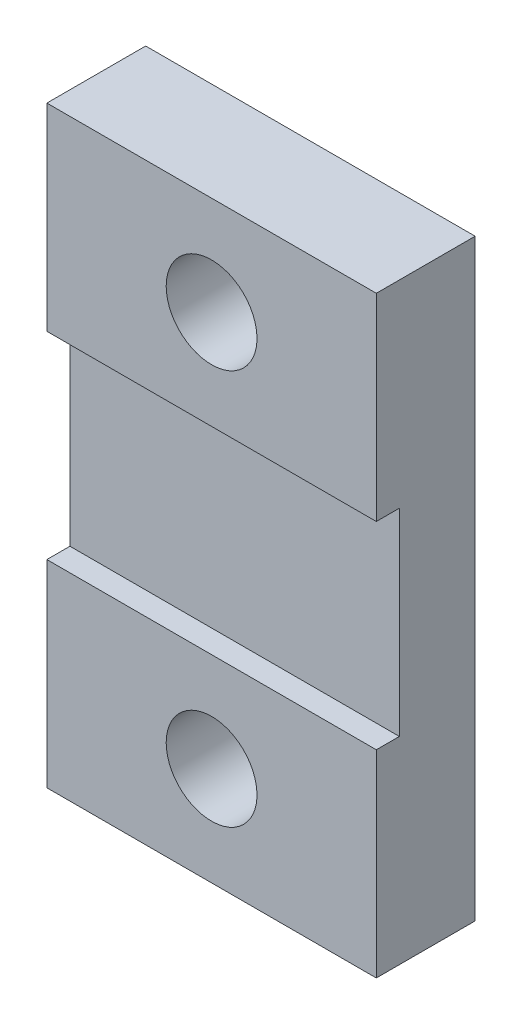
ISO-10303-21;
HEADER;
FILE_DESCRIPTION(('STEP AP214'),'2;1');
FILE_NAME('part.step','',(''),(''),'','','');
FILE_SCHEMA(('AUTOMOTIVE_DESIGN { 1 0 10303 214 1 1 1 1 }'));
ENDSEC;
DATA;
#1=APPLICATION_CONTEXT('core data for automotive mechanical design processes');
#2=APPLICATION_PROTOCOL_DEFINITION('international standard','automotive_design',2000,#1);
#3=PRODUCT_CONTEXT('',#1,'mechanical');
#4=PRODUCT('Part','Part','',(#3));
#5=PRODUCT_RELATED_PRODUCT_CATEGORY('part','',(#4));
#6=PRODUCT_DEFINITION_FORMATION('','',#4);
#7=PRODUCT_DEFINITION_CONTEXT('part definition',#1,'design');
#8=PRODUCT_DEFINITION('design','',#6,#7);
#9=PRODUCT_DEFINITION_SHAPE('','',#8);
#10=(LENGTH_UNIT() NAMED_UNIT(*) SI_UNIT(.MILLI.,.METRE.));
#11=(NAMED_UNIT(*) PLANE_ANGLE_UNIT() SI_UNIT($,.RADIAN.));
#12=(NAMED_UNIT(*) SI_UNIT($,.STERADIAN.) SOLID_ANGLE_UNIT());
#13=UNCERTAINTY_MEASURE_WITH_UNIT(LENGTH_MEASURE(1.E-05),#10,'distance_accuracy_value','');
#14=(GEOMETRIC_REPRESENTATION_CONTEXT(3) GLOBAL_UNCERTAINTY_ASSIGNED_CONTEXT((#13)) GLOBAL_UNIT_ASSIGNED_CONTEXT((#10,
#11,#12)) REPRESENTATION_CONTEXT('',''));
#15=CARTESIAN_POINT('',(0.,0.,0.));
#16=DIRECTION('',(0.,0.,1.));
#17=DIRECTION('',(1.,0.,0.));
#18=AXIS2_PLACEMENT_3D('',#15,#16,#17);
#19=CARTESIAN_POINT('',(0.,0.,3.81));
#20=DIRECTION('',(0.,0.,-1.));
#21=DIRECTION('',(-1.,0.,0.));
#22=AXIS2_PLACEMENT_3D('',#19,#20,#21);
#23=PLANE('',#22);
#24=CARTESIAN_POINT('',(0.,-7.62,3.81));
#25=DIRECTION('',(0.,0.,1.));
#26=DIRECTION('',(-1.,0.,0.));
#27=AXIS2_PLACEMENT_3D('',#24,#25,#26);
#28=CIRCLE('',#27,1.75);
#29=CARTESIAN_POINT('',(-1.75,-7.62,3.81));
#30=VERTEX_POINT('',#29);
#31=EDGE_CURVE('E138',#30,#30,#28,.T.);
#32=ORIENTED_EDGE('',*,*,#31,.F.);
#33=EDGE_LOOP('',(#32));
#34=FACE_BOUND('',#33,.T.);
#35=DIRECTION('',(0.,1.,0.));
#36=VECTOR('',#35,1.);
#37=CARTESIAN_POINT('',(6.34999999999999,-11.43,3.81));
#38=LINE('',#37,#36);
#39=CARTESIAN_POINT('',(6.34999999999999,-11.43,3.81));
#40=VERTEX_POINT('',#39);
#41=CARTESIAN_POINT('',(6.34999999999999,-3.81,3.81));
#42=VERTEX_POINT('',#41);
#43=EDGE_CURVE('E152',#40,#42,#38,.T.);
#44=ORIENTED_EDGE('',*,*,#43,.T.);
#45=DIRECTION('',(1.,0.,0.));
#46=VECTOR('',#45,1.);
#47=CARTESIAN_POINT('',(-6.34999999999999,-3.81,3.81));
#48=LINE('',#47,#46);
#49=CARTESIAN_POINT('',(-6.34999999999999,-3.81,3.81));
#50=VERTEX_POINT('',#49);
#51=EDGE_CURVE('E129',#50,#42,#48,.T.);
#52=ORIENTED_EDGE('',*,*,#51,.F.);
#53=DIRECTION('',(0.,-1.,0.));
#54=VECTOR('',#53,1.);
#55=CARTESIAN_POINT('',(-6.35000000000001,-11.43,3.81));
#56=LINE('',#55,#54);
#57=CARTESIAN_POINT('',(-6.35000000000001,-11.43,3.81));
#58=VERTEX_POINT('',#57);
#59=EDGE_CURVE('E156',#50,#58,#56,.T.);
#60=ORIENTED_EDGE('',*,*,#59,.T.);
#61=DIRECTION('',(1.,0.,0.));
#62=VECTOR('',#61,1.);
#63=CARTESIAN_POINT('',(-6.35000000000001,-11.43,3.81));
#64=LINE('',#63,#62);
#65=EDGE_CURVE('E63',#58,#40,#64,.T.);
#66=ORIENTED_EDGE('',*,*,#65,.T.);
#67=EDGE_LOOP('',(#44,#52,#60,#66));
#68=FACE_BOUND('',#67,.T.);
#69=ADVANCED_FACE('F39',(#34,#68),#23,.F.);
#70=CARTESIAN_POINT('',(-6.35000000000001,11.43,3.81));
#71=VERTEX_POINT('',#70);
#72=CARTESIAN_POINT('',(-6.34999999999999,3.81,3.81));
#73=VERTEX_POINT('',#72);
#74=EDGE_CURVE('E157',#71,#73,#56,.T.);
#75=ORIENTED_EDGE('',*,*,#74,.T.);
#76=DIRECTION('',(-1.,0.,0.));
#77=VECTOR('',#76,1.);
#78=CARTESIAN_POINT('',(-6.34999999999999,3.81,3.81));
#79=LINE('',#78,#77);
#80=CARTESIAN_POINT('',(6.34999999999999,3.81,3.81));
#81=VERTEX_POINT('',#80);
#82=EDGE_CURVE('E189',#81,#73,#79,.T.);
#83=ORIENTED_EDGE('',*,*,#82,.F.);
#84=CARTESIAN_POINT('',(6.34999999999999,11.43,3.81));
#85=VERTEX_POINT('',#84);
#86=EDGE_CURVE('E92',#81,#85,#38,.T.);
#87=ORIENTED_EDGE('',*,*,#86,.T.);
#88=DIRECTION('',(-1.,0.,0.));
#89=VECTOR('',#88,1.);
#90=CARTESIAN_POINT('',(-6.35000000000001,11.43,3.81));
#91=LINE('',#90,#89);
#92=EDGE_CURVE('E154',#85,#71,#91,.T.);
#93=ORIENTED_EDGE('',*,*,#92,.T.);
#94=EDGE_LOOP('',(#75,#83,#87,#93));
#95=FACE_BOUND('',#94,.T.);
#96=CARTESIAN_POINT('',(0.,7.62,3.81));
#97=DIRECTION('',(0.,0.,1.));
#98=DIRECTION('',(1.,0.,0.));
#99=AXIS2_PLACEMENT_3D('',#96,#97,#98);
#100=CIRCLE('',#99,1.75);
#101=CARTESIAN_POINT('',(-1.75,7.62,3.81));
#102=VERTEX_POINT('',#101);
#103=EDGE_CURVE('E146',#102,#102,#100,.T.);
#104=ORIENTED_EDGE('',*,*,#103,.F.);
#105=EDGE_LOOP('',(#104));
#106=FACE_BOUND('',#105,.T.);
#107=ADVANCED_FACE('F208',(#95,#106),#23,.F.);
#108=CARTESIAN_POINT('',(0.,0.,0.));
#109=DIRECTION('',(0.,0.,-1.));
#110=DIRECTION('',(-1.,0.,0.));
#111=AXIS2_PLACEMENT_3D('',#108,#109,#110);
#112=PLANE('',#111);
#113=CARTESIAN_POINT('',(0.,7.62,0.));
#114=DIRECTION('',(0.,0.,1.));
#115=DIRECTION('',(1.,0.,0.));
#116=AXIS2_PLACEMENT_3D('',#113,#114,#115);
#117=CIRCLE('',#116,1.75);
#118=CARTESIAN_POINT('',(-1.75,7.62,0.));
#119=VERTEX_POINT('',#118);
#120=EDGE_CURVE('E141',#119,#119,#117,.T.);
#121=ORIENTED_EDGE('',*,*,#120,.T.);
#122=EDGE_LOOP('',(#121));
#123=FACE_BOUND('',#122,.T.);
#124=DIRECTION('',(0.,1.,0.));
#125=VECTOR('',#124,1.);
#126=CARTESIAN_POINT('',(6.34999999999999,-11.43,0.));
#127=LINE('',#126,#125);
#128=CARTESIAN_POINT('',(6.34999999999999,-11.43,0.));
#129=VERTEX_POINT('',#128);
#130=CARTESIAN_POINT('',(6.34999999999999,11.43,0.));
#131=VERTEX_POINT('',#130);
#132=EDGE_CURVE('E149',#129,#131,#127,.T.);
#133=ORIENTED_EDGE('',*,*,#132,.F.);
#134=DIRECTION('',(1.,0.,0.));
#135=VECTOR('',#134,1.);
#136=CARTESIAN_POINT('',(-6.35000000000001,-11.43,0.));
#137=LINE('',#136,#135);
#138=CARTESIAN_POINT('',(-6.35000000000001,-11.43,0.));
#139=VERTEX_POINT('',#138);
#140=EDGE_CURVE('E84',#139,#129,#137,.T.);
#141=ORIENTED_EDGE('',*,*,#140,.F.);
#142=DIRECTION('',(0.,-1.,0.));
#143=VECTOR('',#142,1.);
#144=CARTESIAN_POINT('',(-6.35000000000001,-11.43,0.));
#145=LINE('',#144,#143);
#146=CARTESIAN_POINT('',(-6.35000000000001,11.43,0.));
#147=VERTEX_POINT('',#146);
#148=EDGE_CURVE('E166',#147,#139,#145,.T.);
#149=ORIENTED_EDGE('',*,*,#148,.F.);
#150=DIRECTION('',(-1.,0.,0.));
#151=VECTOR('',#150,1.);
#152=CARTESIAN_POINT('',(-6.35000000000001,11.43,0.));
#153=LINE('',#152,#151);
#154=EDGE_CURVE('E164',#131,#147,#153,.T.);
#155=ORIENTED_EDGE('',*,*,#154,.F.);
#156=EDGE_LOOP('',(#133,#141,#149,#155));
#157=FACE_BOUND('',#156,.T.);
#158=CARTESIAN_POINT('',(0.,-7.62,0.));
#159=DIRECTION('',(0.,0.,1.));
#160=DIRECTION('',(-1.,0.,0.));
#161=AXIS2_PLACEMENT_3D('',#158,#159,#160);
#162=CIRCLE('',#161,1.75);
#163=CARTESIAN_POINT('',(-1.75,-7.62,0.));
#164=VERTEX_POINT('',#163);
#165=EDGE_CURVE('E142',#164,#164,#162,.T.);
#166=ORIENTED_EDGE('',*,*,#165,.T.);
#167=EDGE_LOOP('',(#166));
#168=FACE_BOUND('',#167,.T.);
#169=ADVANCED_FACE('F182',(#123,#157,#168),#112,.T.);
#170=CARTESIAN_POINT('',(6.34999999999999,-11.43,3.81));
#171=DIRECTION('',(-1.,0.,0.));
#172=DIRECTION('',(0.,0.,1.));
#173=AXIS2_PLACEMENT_3D('',#170,#171,#172);
#174=PLANE('',#173);
#175=DIRECTION('',(0.,1.,0.));
#176=VECTOR('',#175,1.);
#177=CARTESIAN_POINT('',(6.34999999999999,-3.81,2.921));
#178=LINE('',#177,#176);
#179=CARTESIAN_POINT('',(6.34999999999999,-3.81,2.921));
#180=VERTEX_POINT('',#179);
#181=CARTESIAN_POINT('',(6.34999999999999,3.81,2.921));
#182=VERTEX_POINT('',#181);
#183=EDGE_CURVE('E120',#180,#182,#178,.T.);
#184=ORIENTED_EDGE('',*,*,#183,.F.);
#185=DIRECTION('',(0.,0.,1.));
#186=VECTOR('',#185,1.);
#187=CARTESIAN_POINT('',(6.34999999999999,-3.81,2.921));
#188=LINE('',#187,#186);
#189=EDGE_CURVE('E145',#180,#42,#188,.T.);
#190=ORIENTED_EDGE('',*,*,#189,.T.);
#191=ORIENTED_EDGE('',*,*,#43,.F.);
#192=DIRECTION('',(0.,0.,-1.));
#193=VECTOR('',#192,1.);
#194=CARTESIAN_POINT('',(6.34999999999999,-11.43,3.81));
#195=LINE('',#194,#193);
#196=EDGE_CURVE('E161',#40,#129,#195,.T.);
#197=ORIENTED_EDGE('',*,*,#196,.T.);
#198=ORIENTED_EDGE('',*,*,#132,.T.);
#199=DIRECTION('',(0.,0.,-1.));
#200=VECTOR('',#199,1.);
#201=CARTESIAN_POINT('',(6.34999999999999,11.43,3.81));
#202=LINE('',#201,#200);
#203=EDGE_CURVE('E11',#85,#131,#202,.T.);
#204=ORIENTED_EDGE('',*,*,#203,.F.);
#205=ORIENTED_EDGE('',*,*,#86,.F.);
#206=DIRECTION('',(0.,0.,1.));
#207=VECTOR('',#206,1.);
#208=CARTESIAN_POINT('',(6.34999999999999,3.81,2.921));
#209=LINE('',#208,#207);
#210=EDGE_CURVE('E115',#182,#81,#209,.T.);
#211=ORIENTED_EDGE('',*,*,#210,.F.);
#212=EDGE_LOOP('',(#184,#190,#191,#197,#198,#204,#205,#211));
#213=FACE_BOUND('',#212,.T.);
#214=ADVANCED_FACE('F41',(#213),#174,.F.);
#215=CARTESIAN_POINT('',(-6.35000000000001,11.43,3.81));
#216=DIRECTION('',(0.,-1.,0.));
#217=DIRECTION('',(0.,0.,-1.));
#218=AXIS2_PLACEMENT_3D('',#215,#216,#217);
#219=PLANE('',#218);
#220=ORIENTED_EDGE('',*,*,#154,.T.);
#221=DIRECTION('',(0.,0.,-1.));
#222=VECTOR('',#221,1.);
#223=CARTESIAN_POINT('',(-6.35000000000001,11.43,3.81));
#224=LINE('',#223,#222);
#225=EDGE_CURVE('E47',#71,#147,#224,.T.);
#226=ORIENTED_EDGE('',*,*,#225,.F.);
#227=ORIENTED_EDGE('',*,*,#92,.F.);
#228=ORIENTED_EDGE('',*,*,#203,.T.);
#229=EDGE_LOOP('',(#220,#226,#227,#228));
#230=FACE_BOUND('',#229,.T.);
#231=ADVANCED_FACE('F222',(#230),#219,.F.);
#232=CARTESIAN_POINT('',(-6.35000000000001,-11.43,3.81));
#233=DIRECTION('',(1.,0.,0.));
#234=DIRECTION('',(0.,0.,-1.));
#235=AXIS2_PLACEMENT_3D('',#232,#233,#234);
#236=PLANE('',#235);
#237=ORIENTED_EDGE('',*,*,#59,.F.);
#238=DIRECTION('',(0.,0.,1.));
#239=VECTOR('',#238,1.);
#240=CARTESIAN_POINT('',(-6.34999999999999,-3.81,2.921));
#241=LINE('',#240,#239);
#242=CARTESIAN_POINT('',(-6.34999999999999,-3.81,2.921));
#243=VERTEX_POINT('',#242);
#244=EDGE_CURVE('E133',#243,#50,#241,.T.);
#245=ORIENTED_EDGE('',*,*,#244,.F.);
#246=DIRECTION('',(0.,-1.,0.));
#247=VECTOR('',#246,1.);
#248=CARTESIAN_POINT('',(-6.34999999999999,-3.81,2.921));
#249=LINE('',#248,#247);
#250=CARTESIAN_POINT('',(-6.35000000000001,3.81,2.921));
#251=VERTEX_POINT('',#250);
#252=EDGE_CURVE('E119',#251,#243,#249,.T.);
#253=ORIENTED_EDGE('',*,*,#252,.F.);
#254=DIRECTION('',(0.,0.,1.));
#255=VECTOR('',#254,1.);
#256=CARTESIAN_POINT('',(-6.34999999999999,3.81,2.921));
#257=LINE('',#256,#255);
#258=EDGE_CURVE('E117',#251,#73,#257,.T.);
#259=ORIENTED_EDGE('',*,*,#258,.T.);
#260=ORIENTED_EDGE('',*,*,#74,.F.);
#261=ORIENTED_EDGE('',*,*,#225,.T.);
#262=ORIENTED_EDGE('',*,*,#148,.T.);
#263=DIRECTION('',(0.,0.,-1.));
#264=VECTOR('',#263,1.);
#265=CARTESIAN_POINT('',(-6.35000000000001,-11.43,3.81));
#266=LINE('',#265,#264);
#267=EDGE_CURVE('E170',#58,#139,#266,.T.);
#268=ORIENTED_EDGE('',*,*,#267,.F.);
#269=EDGE_LOOP('',(#237,#245,#253,#259,#260,#261,#262,#268));
#270=FACE_BOUND('',#269,.T.);
#271=ADVANCED_FACE('F177',(#270),#236,.F.);
#272=CARTESIAN_POINT('',(-6.35000000000001,-11.43,3.81));
#273=DIRECTION('',(0.,1.,0.));
#274=DIRECTION('',(0.,0.,1.));
#275=AXIS2_PLACEMENT_3D('',#272,#273,#274);
#276=PLANE('',#275);
#277=ORIENTED_EDGE('',*,*,#140,.T.);
#278=ORIENTED_EDGE('',*,*,#196,.F.);
#279=ORIENTED_EDGE('',*,*,#65,.F.);
#280=ORIENTED_EDGE('',*,*,#267,.T.);
#281=EDGE_LOOP('',(#277,#278,#279,#280));
#282=FACE_BOUND('',#281,.T.);
#283=ADVANCED_FACE('F185',(#282),#276,.F.);
#284=CARTESIAN_POINT('',(0.,7.62,3.81));
#285=DIRECTION('',(0.,0.,-1.));
#286=DIRECTION('',(-1.,0.,0.));
#287=AXIS2_PLACEMENT_3D('',#284,#285,#286);
#288=CYLINDRICAL_SURFACE('',#287,1.75);
#289=CARTESIAN_POINT('',(-1.75,7.62,3.81));
#290=CARTESIAN_POINT('',(-1.75,7.62,3.7703125));
#291=CARTESIAN_POINT('',(-1.75,7.62,3.730625));
#292=CARTESIAN_POINT('',(-1.75,7.62,3.65125));
#293=CARTESIAN_POINT('',(-1.75,7.62,3.6115625));
#294=CARTESIAN_POINT('',(-1.75,7.62,3.5321875));
#295=CARTESIAN_POINT('',(-1.75,7.62,3.4925));
#296=CARTESIAN_POINT('',(-1.75,7.62,3.413125));
#297=CARTESIAN_POINT('',(-1.75,7.62,3.3734375));
#298=CARTESIAN_POINT('',(-1.75,7.62,3.2940625));
#299=CARTESIAN_POINT('',(-1.75,7.62,3.254375));
#300=CARTESIAN_POINT('',(-1.75,7.62,3.175));
#301=CARTESIAN_POINT('',(-1.75,7.62,3.1353125));
#302=CARTESIAN_POINT('',(-1.75,7.62,3.0559375));
#303=CARTESIAN_POINT('',(-1.75,7.62,3.01625));
#304=CARTESIAN_POINT('',(-1.75,7.62,2.936875));
#305=CARTESIAN_POINT('',(-1.75,7.62,2.8971875));
#306=CARTESIAN_POINT('',(-1.75,7.62,2.8178125));
#307=CARTESIAN_POINT('',(-1.75,7.62,2.778125));
#308=CARTESIAN_POINT('',(-1.75,7.62,2.69875));
#309=CARTESIAN_POINT('',(-1.75,7.62,2.6590625));
#310=CARTESIAN_POINT('',(-1.75,7.62,2.5796875));
#311=CARTESIAN_POINT('',(-1.75,7.62,2.54));
#312=CARTESIAN_POINT('',(-1.75,7.62,2.460625));
#313=CARTESIAN_POINT('',(-1.75,7.62,2.4209375));
#314=CARTESIAN_POINT('',(-1.75,7.62,2.3415625));
#315=CARTESIAN_POINT('',(-1.75,7.62,2.301875));
#316=CARTESIAN_POINT('',(-1.75,7.62,2.2225));
#317=CARTESIAN_POINT('',(-1.75,7.62,2.1828125));
#318=CARTESIAN_POINT('',(-1.75,7.62,2.1034375));
#319=CARTESIAN_POINT('',(-1.75,7.62,2.06375));
#320=CARTESIAN_POINT('',(-1.75,7.62,1.984375));
#321=CARTESIAN_POINT('',(-1.75,7.62,1.9446875));
#322=CARTESIAN_POINT('',(-1.75,7.62,1.8653125));
#323=CARTESIAN_POINT('',(-1.75,7.62,1.825625));
#324=CARTESIAN_POINT('',(-1.75,7.62,1.74625));
#325=CARTESIAN_POINT('',(-1.75,7.62,1.7065625));
#326=CARTESIAN_POINT('',(-1.75,7.62,1.6271875));
#327=CARTESIAN_POINT('',(-1.75,7.62,1.5875));
#328=CARTESIAN_POINT('',(-1.75,7.62,1.508125));
#329=CARTESIAN_POINT('',(-1.75,7.62,1.4684375));
#330=CARTESIAN_POINT('',(-1.75,7.62,1.3890625));
#331=CARTESIAN_POINT('',(-1.75,7.62,1.349375));
#332=CARTESIAN_POINT('',(-1.75,7.62,1.27));
#333=CARTESIAN_POINT('',(-1.75,7.62,1.2303125));
#334=CARTESIAN_POINT('',(-1.75,7.62,1.1509375));
#335=CARTESIAN_POINT('',(-1.75,7.62,1.11125));
#336=CARTESIAN_POINT('',(-1.75,7.62,1.031875));
#337=CARTESIAN_POINT('',(-1.75,7.62,0.9921875));
#338=CARTESIAN_POINT('',(-1.75,7.62,0.9128125));
#339=CARTESIAN_POINT('',(-1.75,7.62,0.873125));
#340=CARTESIAN_POINT('',(-1.75,7.62,0.79375));
#341=CARTESIAN_POINT('',(-1.75,7.62,0.7540625));
#342=CARTESIAN_POINT('',(-1.75,7.62,0.6746875));
#343=CARTESIAN_POINT('',(-1.75,7.62,0.635));
#344=CARTESIAN_POINT('',(-1.75,7.62,0.555625));
#345=CARTESIAN_POINT('',(-1.75,7.62,0.5159375));
#346=CARTESIAN_POINT('',(-1.75,7.62,0.4365625));
#347=CARTESIAN_POINT('',(-1.75,7.62,0.396875));
#348=CARTESIAN_POINT('',(-1.75,7.62,0.3175));
#349=CARTESIAN_POINT('',(-1.75,7.62,0.2778125));
#350=CARTESIAN_POINT('',(-1.75,7.62,0.1984375));
#351=CARTESIAN_POINT('',(-1.75,7.62,0.15875));
#352=CARTESIAN_POINT('',(-1.75,7.62,0.0793749999999999));
#353=CARTESIAN_POINT('',(-1.75,7.62,0.0396874999999999));
#354=CARTESIAN_POINT('',(-1.75,7.62,0.));
#355=B_SPLINE_CURVE_WITH_KNOTS('',3,(#289,#290,#291,#292,#293,#294,#295,#296,#297,#298,#299,
#300,#301,#302,#303,#304,#305,#306,#307,#308,#309,#310,#311,#312,#313,#314,#315,#316,#317,#318,
#319,#320,#321,#322,#323,#324,#325,#326,#327,#328,#329,#330,#331,#332,#333,#334,#335,#336,#337,
#338,#339,#340,#341,#342,#343,#344,#345,#346,#347,#348,#349,#350,#351,#352,#353,#354),
.UNSPECIFIED.,.F.,.F.,(4,2,2,2,2,2,2,2,2,2,2,2,2,2,2,2,2,2,2,2,2,2,2,2,2,2,2,2,2,2,2,2,4),(0.,
0.1190625,0.238125,0.3571875,0.47625,0.5953125,0.714375,0.8334375,0.9525,1.0715625,1.190625,
1.3096875,1.42875,1.5478125,1.666875,1.7859375,1.905,2.0240625,2.143125,2.2621875,2.38125,
2.5003125,2.619375,2.7384375,2.8575,2.9765625,3.095625,3.2146875,3.33375,3.4528125,3.571875,
3.6909375,3.81),.UNSPECIFIED.);
#356=EDGE_CURVE('BSEAM203',#102,#119,#355,.T.);
#357=ORIENTED_EDGE('',*,*,#103,.T.);
#358=ORIENTED_EDGE('',*,*,#120,.F.);
#359=ORIENTED_EDGE('',*,*,#356,.T.);
#360=ORIENTED_EDGE('',*,*,#356,.F.);
#361=EDGE_LOOP('',(#357,#359,#358,#360));
#362=FACE_BOUND('',#361,.T.);
#363=ADVANCED_FACE('F203',(#362),#288,.F.);
#364=CARTESIAN_POINT('',(0.,-7.62,3.81));
#365=DIRECTION('',(0.,0.,-1.));
#366=DIRECTION('',(-1.,0.,0.));
#367=AXIS2_PLACEMENT_3D('',#364,#365,#366);
#368=CYLINDRICAL_SURFACE('',#367,1.75);
#369=CARTESIAN_POINT('',(-1.75,-7.62,3.81));
#370=CARTESIAN_POINT('',(-1.75,-7.62,3.7703125));
#371=CARTESIAN_POINT('',(-1.75,-7.62,3.730625));
#372=CARTESIAN_POINT('',(-1.75,-7.62,3.65125));
#373=CARTESIAN_POINT('',(-1.75,-7.62,3.6115625));
#374=CARTESIAN_POINT('',(-1.75,-7.62,3.5321875));
#375=CARTESIAN_POINT('',(-1.75,-7.62,3.4925));
#376=CARTESIAN_POINT('',(-1.75,-7.62,3.413125));
#377=CARTESIAN_POINT('',(-1.75,-7.62,3.3734375));
#378=CARTESIAN_POINT('',(-1.75,-7.62,3.2940625));
#379=CARTESIAN_POINT('',(-1.75,-7.62,3.254375));
#380=CARTESIAN_POINT('',(-1.75,-7.62,3.175));
#381=CARTESIAN_POINT('',(-1.75,-7.62,3.1353125));
#382=CARTESIAN_POINT('',(-1.75,-7.62,3.0559375));
#383=CARTESIAN_POINT('',(-1.75,-7.62,3.01625));
#384=CARTESIAN_POINT('',(-1.75,-7.62,2.936875));
#385=CARTESIAN_POINT('',(-1.75,-7.62,2.8971875));
#386=CARTESIAN_POINT('',(-1.75,-7.62,2.8178125));
#387=CARTESIAN_POINT('',(-1.75,-7.62,2.778125));
#388=CARTESIAN_POINT('',(-1.75,-7.62,2.69875));
#389=CARTESIAN_POINT('',(-1.75,-7.62,2.6590625));
#390=CARTESIAN_POINT('',(-1.75,-7.62,2.5796875));
#391=CARTESIAN_POINT('',(-1.75,-7.62,2.54));
#392=CARTESIAN_POINT('',(-1.75,-7.62,2.460625));
#393=CARTESIAN_POINT('',(-1.75,-7.62,2.4209375));
#394=CARTESIAN_POINT('',(-1.75,-7.62,2.3415625));
#395=CARTESIAN_POINT('',(-1.75,-7.62,2.301875));
#396=CARTESIAN_POINT('',(-1.75,-7.62,2.2225));
#397=CARTESIAN_POINT('',(-1.75,-7.62,2.1828125));
#398=CARTESIAN_POINT('',(-1.75,-7.62,2.1034375));
#399=CARTESIAN_POINT('',(-1.75,-7.62,2.06375));
#400=CARTESIAN_POINT('',(-1.75,-7.62,1.984375));
#401=CARTESIAN_POINT('',(-1.75,-7.62,1.9446875));
#402=CARTESIAN_POINT('',(-1.75,-7.62,1.8653125));
#403=CARTESIAN_POINT('',(-1.75,-7.62,1.825625));
#404=CARTESIAN_POINT('',(-1.75,-7.62,1.74625));
#405=CARTESIAN_POINT('',(-1.75,-7.62,1.7065625));
#406=CARTESIAN_POINT('',(-1.75,-7.62,1.6271875));
#407=CARTESIAN_POINT('',(-1.75,-7.62,1.5875));
#408=CARTESIAN_POINT('',(-1.75,-7.62,1.508125));
#409=CARTESIAN_POINT('',(-1.75,-7.62,1.4684375));
#410=CARTESIAN_POINT('',(-1.75,-7.62,1.3890625));
#411=CARTESIAN_POINT('',(-1.75,-7.62,1.349375));
#412=CARTESIAN_POINT('',(-1.75,-7.62,1.27));
#413=CARTESIAN_POINT('',(-1.75,-7.62,1.2303125));
#414=CARTESIAN_POINT('',(-1.75,-7.62,1.1509375));
#415=CARTESIAN_POINT('',(-1.75,-7.62,1.11125));
#416=CARTESIAN_POINT('',(-1.75,-7.62,1.031875));
#417=CARTESIAN_POINT('',(-1.75,-7.62,0.9921875));
#418=CARTESIAN_POINT('',(-1.75,-7.62,0.9128125));
#419=CARTESIAN_POINT('',(-1.75,-7.62,0.873125));
#420=CARTESIAN_POINT('',(-1.75,-7.62,0.79375));
#421=CARTESIAN_POINT('',(-1.75,-7.62,0.7540625));
#422=CARTESIAN_POINT('',(-1.75,-7.62,0.6746875));
#423=CARTESIAN_POINT('',(-1.75,-7.62,0.635));
#424=CARTESIAN_POINT('',(-1.75,-7.62,0.555625));
#425=CARTESIAN_POINT('',(-1.75,-7.62,0.5159375));
#426=CARTESIAN_POINT('',(-1.75,-7.62,0.4365625));
#427=CARTESIAN_POINT('',(-1.75,-7.62,0.396875));
#428=CARTESIAN_POINT('',(-1.75,-7.62,0.3175));
#429=CARTESIAN_POINT('',(-1.75,-7.62,0.2778125));
#430=CARTESIAN_POINT('',(-1.75,-7.62,0.1984375));
#431=CARTESIAN_POINT('',(-1.75,-7.62,0.15875));
#432=CARTESIAN_POINT('',(-1.75,-7.62,0.0793749999999999));
#433=CARTESIAN_POINT('',(-1.75,-7.62,0.0396874999999999));
#434=CARTESIAN_POINT('',(-1.75,-7.62,0.));
#435=B_SPLINE_CURVE_WITH_KNOTS('',3,(#369,#370,#371,#372,#373,#374,#375,#376,#377,#378,#379,
#380,#381,#382,#383,#384,#385,#386,#387,#388,#389,#390,#391,#392,#393,#394,#395,#396,#397,#398,
#399,#400,#401,#402,#403,#404,#405,#406,#407,#408,#409,#410,#411,#412,#413,#414,#415,#416,#417,
#418,#419,#420,#421,#422,#423,#424,#425,#426,#427,#428,#429,#430,#431,#432,#433,#434),
.UNSPECIFIED.,.F.,.F.,(4,2,2,2,2,2,2,2,2,2,2,2,2,2,2,2,2,2,2,2,2,2,2,2,2,2,2,2,2,2,2,2,4),(0.,
0.1190625,0.238125,0.3571875,0.47625,0.5953125,0.714375,0.8334375,0.9525,1.0715625,1.190625,
1.3096875,1.42875,1.5478125,1.666875,1.7859375,1.905,2.0240625,2.143125,2.2621875,2.38125,
2.5003125,2.619375,2.7384375,2.8575,2.9765625,3.095625,3.2146875,3.33375,3.4528125,3.571875,
3.6909375,3.81),.UNSPECIFIED.);
#436=EDGE_CURVE('BSEAM195',#30,#164,#435,.T.);
#437=ORIENTED_EDGE('',*,*,#31,.T.);
#438=ORIENTED_EDGE('',*,*,#165,.F.);
#439=ORIENTED_EDGE('',*,*,#436,.T.);
#440=ORIENTED_EDGE('',*,*,#436,.F.);
#441=EDGE_LOOP('',(#437,#439,#438,#440));
#442=FACE_BOUND('',#441,.T.);
#443=ADVANCED_FACE('F195',(#442),#368,.F.);
#444=CARTESIAN_POINT('',(-6.34999999999999,-3.81,2.921));
#445=DIRECTION('',(0.,-1.,0.));
#446=DIRECTION('',(0.,0.,-1.));
#447=AXIS2_PLACEMENT_3D('',#444,#445,#446);
#448=PLANE('',#447);
#449=ORIENTED_EDGE('',*,*,#51,.T.);
#450=ORIENTED_EDGE('',*,*,#189,.F.);
#451=DIRECTION('',(1.,0.,0.));
#452=VECTOR('',#451,1.);
#453=CARTESIAN_POINT('',(-6.34999999999999,-3.81,2.921));
#454=LINE('',#453,#452);
#455=EDGE_CURVE('E126',#243,#180,#454,.T.);
#456=ORIENTED_EDGE('',*,*,#455,.F.);
#457=ORIENTED_EDGE('',*,*,#244,.T.);
#458=EDGE_LOOP('',(#449,#450,#456,#457));
#459=FACE_BOUND('',#458,.T.);
#460=ADVANCED_FACE('F193',(#459),#448,.F.);
#461=CARTESIAN_POINT('',(-6.34999999999999,3.81,2.921));
#462=DIRECTION('',(0.,1.,0.));
#463=DIRECTION('',(0.,0.,1.));
#464=AXIS2_PLACEMENT_3D('',#461,#462,#463);
#465=PLANE('',#464);
#466=ORIENTED_EDGE('',*,*,#82,.T.);
#467=ORIENTED_EDGE('',*,*,#258,.F.);
#468=DIRECTION('',(-1.,0.,0.));
#469=VECTOR('',#468,1.);
#470=CARTESIAN_POINT('',(-6.34999999999999,3.81,2.921));
#471=LINE('',#470,#469);
#472=EDGE_CURVE('E54',#182,#251,#471,.T.);
#473=ORIENTED_EDGE('',*,*,#472,.F.);
#474=ORIENTED_EDGE('',*,*,#210,.T.);
#475=EDGE_LOOP('',(#466,#467,#473,#474));
#476=FACE_BOUND('',#475,.T.);
#477=ADVANCED_FACE('F113',(#476),#465,.F.);
#478=CARTESIAN_POINT('',(0.,0.,2.921));
#479=DIRECTION('',(0.,0.,-1.));
#480=DIRECTION('',(-1.,0.,0.));
#481=AXIS2_PLACEMENT_3D('',#478,#479,#480);
#482=PLANE('',#481);
#483=ORIENTED_EDGE('',*,*,#183,.T.);
#484=ORIENTED_EDGE('',*,*,#472,.T.);
#485=ORIENTED_EDGE('',*,*,#252,.T.);
#486=ORIENTED_EDGE('',*,*,#455,.T.);
#487=EDGE_LOOP('',(#483,#484,#485,#486));
#488=FACE_BOUND('',#487,.T.);
#489=ADVANCED_FACE('F124',(#488),#482,.F.);
#490=CLOSED_SHELL('',(#69,#107,#169,#214,#231,#271,#283,#363,#443,#460,#477,#489));
#491=MANIFOLD_SOLID_BREP('B2',#490);
#492=ADVANCED_BREP_SHAPE_REPRESENTATION('',(#18,#491),#14);
#493=SHAPE_DEFINITION_REPRESENTATION(#9,#492);
ENDSEC;
END-ISO-10303-21;
